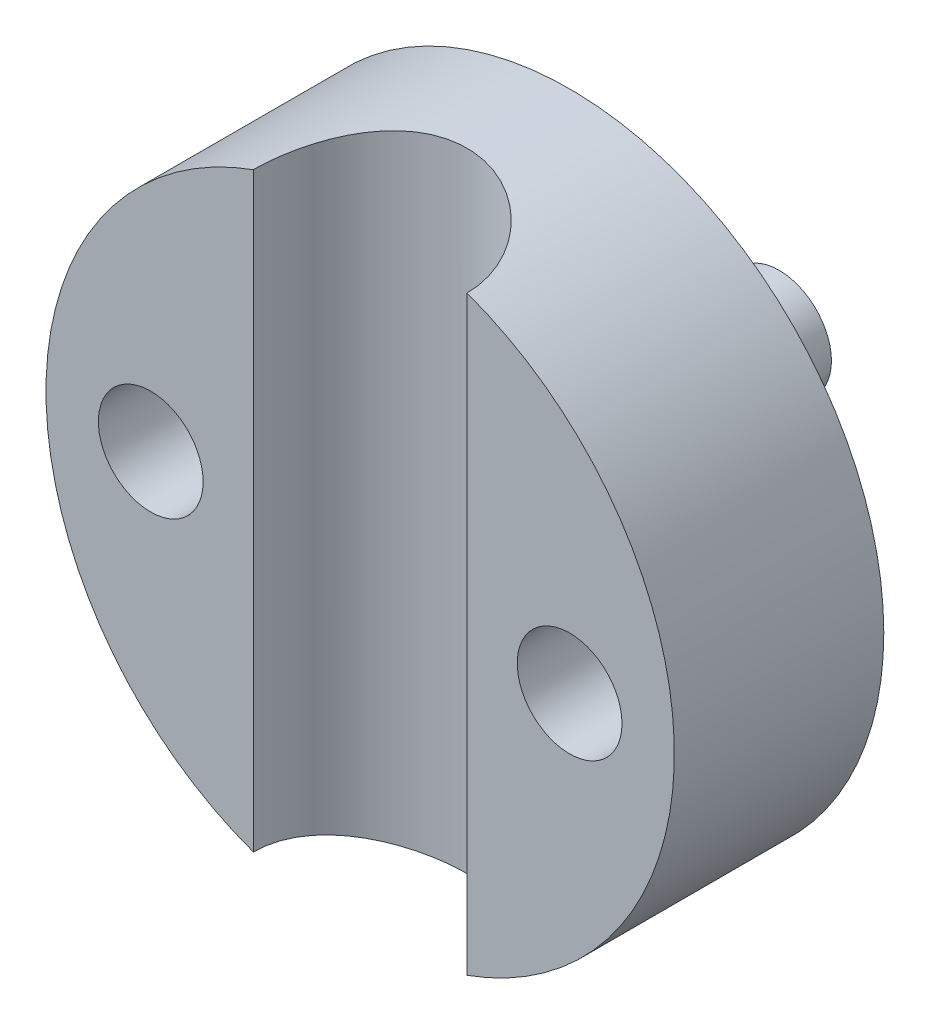
ISO-10303-21;
HEADER;
FILE_DESCRIPTION(('STEP AP214'),'2;1');
FILE_NAME('part.step','',(''),(''),'','','');
FILE_SCHEMA(('AUTOMOTIVE_DESIGN { 1 0 10303 214 1 1 1 1 }'));
ENDSEC;
DATA;
#1=APPLICATION_CONTEXT('core data for automotive mechanical design processes');
#2=APPLICATION_PROTOCOL_DEFINITION('international standard','automotive_design',2000,#1);
#3=PRODUCT_CONTEXT('',#1,'mechanical');
#4=PRODUCT('Part','Part','',(#3));
#5=PRODUCT_RELATED_PRODUCT_CATEGORY('part','',(#4));
#6=PRODUCT_DEFINITION_FORMATION('','',#4);
#7=PRODUCT_DEFINITION_CONTEXT('part definition',#1,'design');
#8=PRODUCT_DEFINITION('design','',#6,#7);
#9=PRODUCT_DEFINITION_SHAPE('','',#8);
#10=(LENGTH_UNIT() NAMED_UNIT(*) SI_UNIT(.MILLI.,.METRE.));
#11=(NAMED_UNIT(*) PLANE_ANGLE_UNIT() SI_UNIT($,.RADIAN.));
#12=(NAMED_UNIT(*) SI_UNIT($,.STERADIAN.) SOLID_ANGLE_UNIT());
#13=UNCERTAINTY_MEASURE_WITH_UNIT(LENGTH_MEASURE(1.E-05),#10,'distance_accuracy_value','');
#14=(GEOMETRIC_REPRESENTATION_CONTEXT(3) GLOBAL_UNCERTAINTY_ASSIGNED_CONTEXT((#13)) GLOBAL_UNIT_ASSIGNED_CONTEXT((#10,
#11,#12)) REPRESENTATION_CONTEXT('',''));
#15=CARTESIAN_POINT('',(0.,0.,0.));
#16=DIRECTION('',(0.,0.,1.));
#17=DIRECTION('',(1.,0.,0.));
#18=AXIS2_PLACEMENT_3D('',#15,#16,#17);
#19=CARTESIAN_POINT('',(0.,0.,12.7));
#20=DIRECTION('',(0.,0.,-1.));
#21=DIRECTION('',(-1.,0.,0.));
#22=AXIS2_PLACEMENT_3D('',#19,#20,#21);
#23=CYLINDRICAL_SURFACE('',#22,19.05);
#24=CARTESIAN_POINT('',(0.,0.,0.));
#25=DIRECTION('',(0.,0.,1.));
#26=DIRECTION('',(1.,0.,0.));
#27=AXIS2_PLACEMENT_3D('',#24,#25,#26);
#28=CIRCLE('',#27,19.05);
#29=CARTESIAN_POINT('',(19.05,0.,0.));
#30=VERTEX_POINT('',#29);
#31=EDGE_CURVE('E73',#30,#30,#28,.T.);
#32=ORIENTED_EDGE('',*,*,#31,.T.);
#33=EDGE_LOOP('',(#32));
#34=FACE_BOUND('',#33,.T.);
#35=CARTESIAN_POINT('',(6.47699999999999,17.9151045489553,12.7));
#36=CARTESIAN_POINT('',(6.47702534828076,17.9150748305242,12.5235165475312));
#37=CARTESIAN_POINT('',(6.46978801662175,17.917711386757,12.3470443935045));
#38=CARTESIAN_POINT('',(6.44097680104019,17.9280994105072,11.9954737507611));
#39=CARTESIAN_POINT('',(6.4194069276115,17.9358494471797,11.8203748916365));
#40=CARTESIAN_POINT('',(6.36220645105465,17.9562159683009,11.4733308340743));
#41=CARTESIAN_POINT('',(6.32661885693651,17.9688175646031,11.3013776571298));
#42=CARTESIAN_POINT('',(6.24172333638176,17.998483898519,10.9612842177305));
#43=CARTESIAN_POINT('',(6.19241488444516,18.0155488070731,10.7931441015801));
#44=CARTESIAN_POINT('',(6.08055828703803,18.0536087870223,10.4619499226804));
#45=CARTESIAN_POINT('',(6.01802125193456,18.0746005586395,10.2988917227901));
#46=CARTESIAN_POINT('',(5.88016700117092,18.1199172071232,9.97868382205535));
#47=CARTESIAN_POINT('',(5.8048450299127,18.1442433236119,9.82153634648455));
#48=CARTESIAN_POINT('',(5.64198231004348,18.1955440154444,9.51412033778887));
#49=CARTESIAN_POINT('',(5.55443901965061,18.2225191413805,9.36385324429703));
#50=CARTESIAN_POINT('',(5.36771255883912,18.2783932430714,9.07103936947184));
#51=CARTESIAN_POINT('',(5.26852519960709,18.3072929095286,8.92849539355411));
#52=CARTESIAN_POINT('',(5.05533434841082,18.3673296453135,8.64692282291209));
#53=CARTESIAN_POINT('',(4.94092198856477,18.398509881975,8.50821285094172));
#54=CARTESIAN_POINT('',(4.70101687049525,18.4612651450173,8.24082587078322));
#55=CARTESIAN_POINT('',(4.57552388727333,18.4928401794036,8.1121490664243));
#56=CARTESIAN_POINT('',(4.3141518472243,18.5555560792226,7.86554859587034));
#57=CARTESIAN_POINT('',(4.17826737068099,18.5866967079402,7.7476306122559));
#58=CARTESIAN_POINT('',(3.89703263138712,18.6476896826207,7.52341851017628));
#59=CARTESIAN_POINT('',(3.75168567540193,18.6775424726334,7.41712036545513));
#60=CARTESIAN_POINT('',(3.4481406957571,18.7359914181175,7.21400589180445));
#61=CARTESIAN_POINT('',(3.28969617099699,18.7645285937695,7.11754044329463));
#62=CARTESIAN_POINT('',(2.96478253789072,18.8185992175984,6.93840331195255));
#63=CARTESIAN_POINT('',(2.79831657406827,18.8441338295356,6.85572627965216));
#64=CARTESIAN_POINT('',(2.45858331696745,18.8914594953902,6.70488524047806));
#65=CARTESIAN_POINT('',(2.28532201641907,18.9132537605655,6.63670877205241));
#66=CARTESIAN_POINT('',(1.93319141734603,18.952484637066,6.515423642005));
#67=CARTESIAN_POINT('',(1.75432354497232,18.9699223466111,6.46231118252394));
#68=CARTESIAN_POINT('',(1.31692241517264,19.0061632023526,6.35279515436016));
#69=CARTESIAN_POINT('',(1.05618306718973,19.0225203675833,6.30420240734888));
#70=CARTESIAN_POINT('',(0.530262450130259,19.0444363091269,6.23930870093945));
#71=CARTESIAN_POINT('',(0.265081448627456,19.0499957335735,6.22300580334402));
#72=CARTESIAN_POINT('',(-0.176438341944293,19.0500028397356,6.22299613729138));
#73=CARTESIAN_POINT('',(-0.352832579574388,19.0475446110804,6.23021227865421));
#74=CARTESIAN_POINT('',(-0.70436408731692,19.0377850474138,6.25899955015108));
#75=CARTESIAN_POINT('',(-0.879501127770772,19.0304828491984,6.28057323882758));
#76=CARTESIAN_POINT('',(-1.22726887197268,19.0112247916056,6.33789179125276));
#77=CARTESIAN_POINT('',(-1.39989818234291,18.9992664405409,6.37364424279492));
#78=CARTESIAN_POINT('',(-1.74139927202808,18.9710147055168,6.45900256293717));
#79=CARTESIAN_POINT('',(-1.91026959863235,18.9547196760593,6.50861369039292));
#80=CARTESIAN_POINT('',(-2.2426343905884,18.9182705501781,6.62111717296384));
#81=CARTESIAN_POINT('',(-2.40614105195636,18.8981260398923,6.68397657587062));
#82=CARTESIAN_POINT('',(-2.72718301405027,18.8544763085006,6.82253360568837));
#83=CARTESIAN_POINT('',(-2.88471604222607,18.8309698243083,6.8982360597052));
#84=CARTESIAN_POINT('',(-3.34673351482945,18.7563023098566,7.14371184773488));
#85=CARTESIAN_POINT('',(-3.6409565324091,18.700956367906,7.33196272404236));
#86=CARTESIAN_POINT('',(-4.20365176930587,18.5827159003846,7.75938242614079));
#87=CARTESIAN_POINT('',(-4.4709827090804,18.5196350696581,8.00000172440857));
#88=CARTESIAN_POINT('',(-4.83937650380282,18.4255011378798,8.39138177098701));
#89=CARTESIAN_POINT('',(-4.95680715961612,18.394183940284,8.52701623009659));
#90=CARTESIAN_POINT('',(-5.18010313620381,18.3325508679206,8.8076774717914));
#91=CARTESIAN_POINT('',(-5.28597269314974,18.3022346292454,8.95270078291528));
#92=CARTESIAN_POINT('',(-5.48854256599676,18.2425301405739,9.25591768502503));
#93=CARTESIAN_POINT('',(-5.5848576438351,18.2131996584886,9.41437998793801));
#94=CARTESIAN_POINT('',(-5.76369771735687,18.1573968614764,9.73930852288627));
#95=CARTESIAN_POINT('',(-5.84622801363533,18.1309234493264,9.90577164654989));
#96=CARTESIAN_POINT('',(-5.99680188036671,18.0816799218411,10.24553718676));
#97=CARTESIAN_POINT('',(-6.06485496848905,18.0589073758057,10.4188350206026));
#98=CARTESIAN_POINT('',(-6.18589929681761,18.0178028392713,10.7710419508032));
#99=CARTESIAN_POINT('',(-6.23889442469167,17.9994697027854,10.9499495855524));
#100=CARTESIAN_POINT('',(-6.34791450640724,17.9613797736106,11.3866913122976));
#101=CARTESIAN_POINT('',(-6.39623422029684,17.9441342077959,11.6467454289004));
#102=CARTESIAN_POINT('',(-6.44464151796232,17.9267773137026,12.0399738643063));
#103=CARTESIAN_POINT('',(-6.45676525910539,17.9224102282099,12.1716119258315));
#104=CARTESIAN_POINT('',(-6.47294549190853,17.9165710615568,12.4354846197782));
#105=CARTESIAN_POINT('',(-6.47699966590725,17.9150998121112,12.5677194126607));
#106=CARTESIAN_POINT('',(-6.47700000000001,17.9151045489553,12.7));
#107=B_SPLINE_CURVE_WITH_KNOTS('',3,(#35,#36,#37,#38,#39,#40,#41,#42,#43,#44,#45,#46,#47,#48,
#49,#50,#51,#52,#53,#54,#55,#56,#57,#58,#59,#60,#61,#62,#63,#64,#65,#66,#67,#68,#69,#70,#71,#72,
#73,#74,#75,#76,#77,#78,#79,#80,#81,#82,#83,#84,#85,#86,#87,#88,#89,#90,#91,#92,#93,#94,#95,#96,
#97,#98,#99,#100,#101,#102,#103,#104,#105,#106),.UNSPECIFIED.,.F.,.F.,(4,2,2,2,2,2,2,2,2,2,2,2,
2,2,2,2,2,2,2,2,2,2,2,2,2,2,2,2,2,2,2,2,2,2,2,4),(0.,0.529264812402781,1.05838158965913,
1.58588742660601,2.11341346946735,2.64049820271246,3.16777942644548,3.69517047760893,
4.22275183610053,4.76960533890781,5.31646994844628,5.86362174811743,6.4105833555485,
6.97293253348236,7.53506302765954,8.0967084663448,8.65821217979031,9.45314340246388,
10.2480269079677,10.7771017582681,11.3062709159759,11.8357236425867,12.3653775505048,
12.893729286687,13.4222800474665,14.4783731073121,15.5686385637497,16.1144898751053,
16.6601405019048,17.2226803114354,17.7850033097835,18.346955472952,18.9087624190701,
19.7014513447292,20.0980183834608,20.4946993038335),.UNSPECIFIED.);
#108=CARTESIAN_POINT('',(6.47699999999999,17.9151045489553,12.7));
#109=VERTEX_POINT('',#108);
#110=CARTESIAN_POINT('',(-6.477,17.9151045489553,12.7));
#111=VERTEX_POINT('',#110);
#112=EDGE_CURVE('E55',#109,#111,#107,.T.);
#113=ORIENTED_EDGE('',*,*,#112,.F.);
#114=CARTESIAN_POINT('',(0.,0.,12.7));
#115=DIRECTION('',(0.,0.,1.));
#116=DIRECTION('',(1.,0.,0.));
#117=AXIS2_PLACEMENT_3D('',#114,#115,#116);
#118=CIRCLE('',#117,19.05);
#119=CARTESIAN_POINT('',(6.47699999999999,-17.9151045489553,12.7));
#120=VERTEX_POINT('',#119);
#121=EDGE_CURVE('E63',#120,#109,#118,.T.);
#122=ORIENTED_EDGE('',*,*,#121,.F.);
#123=CARTESIAN_POINT('',(-6.47700000000001,-17.9151045489553,12.7));
#124=CARTESIAN_POINT('',(-6.47702534828078,-17.9150748305242,12.5235165475312));
#125=CARTESIAN_POINT('',(-6.46978801662177,-17.917711386757,12.3470443935045));
#126=CARTESIAN_POINT('',(-6.44097680104021,-17.9280994105072,11.9954737507611));
#127=CARTESIAN_POINT('',(-6.41940692761152,-17.9358494471797,11.8203748916365));
#128=CARTESIAN_POINT('',(-6.36220645105467,-17.9562159683009,11.4733308340743));
#129=CARTESIAN_POINT('',(-6.32661885693652,-17.9688175646031,11.3013776571298));
#130=CARTESIAN_POINT('',(-6.24172333638178,-17.998483898519,10.9612842177305));
#131=CARTESIAN_POINT('',(-6.19241488444517,-18.0155488070731,10.7931441015801));
#132=CARTESIAN_POINT('',(-6.08055828703805,-18.0536087870223,10.4619499226805));
#133=CARTESIAN_POINT('',(-6.01802125193458,-18.0746005586395,10.2988917227901));
#134=CARTESIAN_POINT('',(-5.88016700117094,-18.1199172071232,9.97868382205535));
#135=CARTESIAN_POINT('',(-5.80484502991272,-18.1442433236119,9.82153634648455));
#136=CARTESIAN_POINT('',(-5.6419823100435,-18.1955440154444,9.51412033778887));
#137=CARTESIAN_POINT('',(-5.55443901965062,-18.2225191413805,9.36385324429703));
#138=CARTESIAN_POINT('',(-5.36771255883914,-18.2783932430714,9.07103936947184));
#139=CARTESIAN_POINT('',(-5.2685251996071,-18.3072929095286,8.92849539355411));
#140=CARTESIAN_POINT('',(-5.05533434841084,-18.3673296453135,8.64692282291209));
#141=CARTESIAN_POINT('',(-4.94092198856479,-18.398509881975,8.50821285094172));
#142=CARTESIAN_POINT('',(-4.70101687049527,-18.4612651450173,8.24082587078322));
#143=CARTESIAN_POINT('',(-4.57552388727334,-18.4928401794036,8.1121490664243));
#144=CARTESIAN_POINT('',(-4.31415184722432,-18.5555560792226,7.86554859587034));
#145=CARTESIAN_POINT('',(-4.178267370681,-18.5866967079402,7.7476306122559));
#146=CARTESIAN_POINT('',(-3.89703263138713,-18.6476896826207,7.52341851017628));
#147=CARTESIAN_POINT('',(-3.75168567540195,-18.6775424726334,7.41712036545513));
#148=CARTESIAN_POINT('',(-3.44814069575711,-18.7359914181175,7.21400589180445));
#149=CARTESIAN_POINT('',(-3.28969617099701,-18.7645285937695,7.11754044329463));
#150=CARTESIAN_POINT('',(-2.96478253789074,-18.8185992175984,6.93840331195256));
#151=CARTESIAN_POINT('',(-2.79831657406829,-18.8441338295356,6.85572627965216));
#152=CARTESIAN_POINT('',(-2.45858331696747,-18.8914594953902,6.70488524047806));
#153=CARTESIAN_POINT('',(-2.28532201641909,-18.9132537605654,6.63670877205242));
#154=CARTESIAN_POINT('',(-1.93319141734605,-18.952484637066,6.515423642005));
#155=CARTESIAN_POINT('',(-1.75432354497234,-18.9699223466111,6.46231118252394));
#156=CARTESIAN_POINT('',(-1.31692241517266,-19.0061632023526,6.35279515436016));
#157=CARTESIAN_POINT('',(-1.05618306718975,-19.0225203675833,6.30420240734888));
#158=CARTESIAN_POINT('',(-0.53026245013027,-19.0444363091269,6.23930870093945));
#159=CARTESIAN_POINT('',(-0.265081448627465,-19.0499957335735,6.22300580334402));
#160=CARTESIAN_POINT('',(0.176438341944286,-19.0500028397356,6.22299613729138));
#161=CARTESIAN_POINT('',(0.352832579574381,-19.0475446110804,6.23021227865421));
#162=CARTESIAN_POINT('',(0.704364087316914,-19.0377850474138,6.25899955015108));
#163=CARTESIAN_POINT('',(0.879501127770766,-19.0304828491984,6.28057323882758));
#164=CARTESIAN_POINT('',(1.22726887197267,-19.0112247916056,6.33789179125276));
#165=CARTESIAN_POINT('',(1.3998981823429,-18.9992664405409,6.37364424279492));
#166=CARTESIAN_POINT('',(1.74139927202807,-18.9710147055168,6.45900256293717));
#167=CARTESIAN_POINT('',(1.91026959863234,-18.9547196760593,6.50861369039292));
#168=CARTESIAN_POINT('',(2.24263439058839,-18.9182705501781,6.62111717296384));
#169=CARTESIAN_POINT('',(2.40614105195635,-18.8981260398923,6.68397657587062));
#170=CARTESIAN_POINT('',(2.72718301405026,-18.8544763085006,6.82253360568837));
#171=CARTESIAN_POINT('',(2.88471604222606,-18.8309698243083,6.89823605970521));
#172=CARTESIAN_POINT('',(3.34673351482945,-18.7563023098566,7.14371184773488));
#173=CARTESIAN_POINT('',(3.64095653240909,-18.700956367906,7.33196272404237));
#174=CARTESIAN_POINT('',(4.20365176930587,-18.5827159003846,7.7593824261408));
#175=CARTESIAN_POINT('',(4.47098270908039,-18.5196350696581,8.00000172440858));
#176=CARTESIAN_POINT('',(4.83937650380281,-18.4255011378798,8.39138177098702));
#177=CARTESIAN_POINT('',(4.95680715961611,-18.394183940284,8.5270162300966));
#178=CARTESIAN_POINT('',(5.1801031362038,-18.3325508679206,8.8076774717914));
#179=CARTESIAN_POINT('',(5.28597269314973,-18.3022346292454,8.95270078291529));
#180=CARTESIAN_POINT('',(5.48854256599675,-18.2425301405739,9.25591768502504));
#181=CARTESIAN_POINT('',(5.58485764383509,-18.2131996584886,9.41437998793802));
#182=CARTESIAN_POINT('',(5.76369771735687,-18.1573968614764,9.73930852288628));
#183=CARTESIAN_POINT('',(5.84622801363532,-18.1309234493264,9.9057716465499));
#184=CARTESIAN_POINT('',(5.9968018803667,-18.0816799218411,10.24553718676));
#185=CARTESIAN_POINT('',(6.06485496848904,-18.0589073758057,10.4188350206026));
#186=CARTESIAN_POINT('',(6.1858992968176,-18.0178028392713,10.7710419508033));
#187=CARTESIAN_POINT('',(6.23889442469166,-17.9994697027854,10.9499495855524));
#188=CARTESIAN_POINT('',(6.34791450640722,-17.9613797736106,11.3866913122977));
#189=CARTESIAN_POINT('',(6.39623422029682,-17.9441342077959,11.6467454289004));
#190=CARTESIAN_POINT('',(6.4446415179623,-17.9267773137026,12.0399738643063));
#191=CARTESIAN_POINT('',(6.45676525910537,-17.9224102282099,12.1716119258315));
#192=CARTESIAN_POINT('',(6.47294549190851,-17.9165710615568,12.4354846197783));
#193=CARTESIAN_POINT('',(6.47699966590724,-17.9150998121112,12.5677194126607));
#194=CARTESIAN_POINT('',(6.47699999999999,-17.9151045489553,12.7));
#195=B_SPLINE_CURVE_WITH_KNOTS('',3,(#123,#124,#125,#126,#127,#128,#129,#130,#131,#132,#133,
#134,#135,#136,#137,#138,#139,#140,#141,#142,#143,#144,#145,#146,#147,#148,#149,#150,#151,#152,
#153,#154,#155,#156,#157,#158,#159,#160,#161,#162,#163,#164,#165,#166,#167,#168,#169,#170,#171,
#172,#173,#174,#175,#176,#177,#178,#179,#180,#181,#182,#183,#184,#185,#186,#187,#188,#189,#190,
#191,#192,#193,#194),.UNSPECIFIED.,.F.,.F.,(4,2,2,2,2,2,2,2,2,2,2,2,2,2,2,2,2,2,2,2,2,2,2,2,2,2,
2,2,2,2,2,2,2,2,2,4),(0.,0.529264812402783,1.05838158965913,1.58588742660601,2.11341346946734,
2.64049820271246,3.16777942644547,3.69517047760893,4.22275183610052,4.76960533890781,
5.31646994844627,5.86362174811742,6.41058335554849,6.97293253348235,7.53506302765953,
8.09670846634479,8.6582121797903,9.45314340246388,10.2480269079677,10.7771017582681,
11.3062709159759,11.8357236425867,12.3653775505048,12.893729286687,13.4222800474665,
14.4783731073121,15.5686385637497,16.1144898751053,16.6601405019048,17.2226803114354,
17.7850033097835,18.346955472952,18.9087624190701,19.7014513447292,20.0980183834608,
20.4946993038335),.UNSPECIFIED.);
#196=CARTESIAN_POINT('',(-6.47700000000001,-17.9151045489553,12.7));
#197=VERTEX_POINT('',#196);
#198=EDGE_CURVE('E50',#197,#120,#195,.T.);
#199=ORIENTED_EDGE('',*,*,#198,.F.);
#200=EDGE_CURVE('E65',#111,#197,#118,.T.);
#201=ORIENTED_EDGE('',*,*,#200,.F.);
#202=EDGE_LOOP('',(#113,#122,#199,#201));
#203=FACE_BOUND('',#202,.T.);
#204=ADVANCED_FACE('F33',(#34,#203),#23,.T.);
#205=CARTESIAN_POINT('',(0.,0.,12.7));
#206=DIRECTION('',(0.,0.,1.));
#207=DIRECTION('',(1.,0.,0.));
#208=AXIS2_PLACEMENT_3D('',#205,#206,#207);
#209=PLANE('',#208);
#210=CARTESIAN_POINT('',(-12.7,0.,12.7));
#211=DIRECTION('',(0.,0.,1.));
#212=DIRECTION('',(1.,0.,0.));
#213=AXIS2_PLACEMENT_3D('',#210,#211,#212);
#214=CIRCLE('',#213,3.175);
#215=CARTESIAN_POINT('',(-9.525,0.,12.7));
#216=VERTEX_POINT('',#215);
#217=EDGE_CURVE('E91',#216,#216,#214,.T.);
#218=ORIENTED_EDGE('',*,*,#217,.F.);
#219=EDGE_LOOP('',(#218));
#220=FACE_BOUND('',#219,.T.);
#221=ORIENTED_EDGE('',*,*,#200,.T.);
#222=DIRECTION('',(0.,-1.,0.));
#223=VECTOR('',#222,1.);
#224=CARTESIAN_POINT('',(-6.47700000000001,19.05,12.7));
#225=LINE('',#224,#223);
#226=EDGE_CURVE('E11',#197,#111,#225,.F.);
#227=ORIENTED_EDGE('',*,*,#226,.T.);
#228=EDGE_LOOP('',(#221,#227));
#229=FACE_BOUND('',#228,.T.);
#230=ADVANCED_FACE('F116',(#220,#229),#209,.T.);
#231=CARTESIAN_POINT('',(12.7,0.,12.7));
#232=DIRECTION('',(0.,0.,1.));
#233=DIRECTION('',(1.,0.,0.));
#234=AXIS2_PLACEMENT_3D('',#231,#232,#233);
#235=CIRCLE('',#234,3.175);
#236=CARTESIAN_POINT('',(15.875,0.,12.7));
#237=VERTEX_POINT('',#236);
#238=EDGE_CURVE('E82',#237,#237,#235,.T.);
#239=ORIENTED_EDGE('',*,*,#238,.F.);
#240=EDGE_LOOP('',(#239));
#241=FACE_BOUND('',#240,.T.);
#242=ORIENTED_EDGE('',*,*,#121,.T.);
#243=DIRECTION('',(0.,-1.,0.));
#244=VECTOR('',#243,1.);
#245=CARTESIAN_POINT('',(6.47699999999999,19.05,12.7));
#246=LINE('',#245,#244);
#247=EDGE_CURVE('E42',#109,#120,#246,.T.);
#248=ORIENTED_EDGE('',*,*,#247,.T.);
#249=EDGE_LOOP('',(#242,#248));
#250=FACE_BOUND('',#249,.T.);
#251=ADVANCED_FACE('F72',(#241,#250),#209,.T.);
#252=CARTESIAN_POINT('',(0.,0.,0.));
#253=DIRECTION('',(0.,0.,1.));
#254=DIRECTION('',(1.,0.,0.));
#255=AXIS2_PLACEMENT_3D('',#252,#253,#254);
#256=PLANE('',#255);
#257=CARTESIAN_POINT('',(-12.7,0.,0.));
#258=DIRECTION('',(0.,0.,1.));
#259=DIRECTION('',(1.,0.,0.));
#260=AXIS2_PLACEMENT_3D('',#257,#258,#259);
#261=CIRCLE('',#260,3.175);
#262=CARTESIAN_POINT('',(-9.525,0.,0.));
#263=VERTEX_POINT('',#262);
#264=EDGE_CURVE('E37',#263,#263,#261,.T.);
#265=ORIENTED_EDGE('',*,*,#264,.T.);
#266=EDGE_LOOP('',(#265));
#267=FACE_BOUND('',#266,.T.);
#268=CARTESIAN_POINT('',(12.7,0.,0.));
#269=DIRECTION('',(0.,0.,1.));
#270=DIRECTION('',(1.,0.,0.));
#271=AXIS2_PLACEMENT_3D('',#268,#269,#270);
#272=CIRCLE('',#271,3.175);
#273=CARTESIAN_POINT('',(15.875,0.,0.));
#274=VERTEX_POINT('',#273);
#275=EDGE_CURVE('E80',#274,#274,#272,.T.);
#276=ORIENTED_EDGE('',*,*,#275,.T.);
#277=EDGE_LOOP('',(#276));
#278=FACE_BOUND('',#277,.T.);
#279=ORIENTED_EDGE('',*,*,#31,.F.);
#280=EDGE_LOOP('',(#279));
#281=FACE_BOUND('',#280,.T.);
#282=CARTESIAN_POINT('',(0.,0.,0.));
#283=DIRECTION('',(0.,0.,1.));
#284=DIRECTION('',(1.,0.,0.));
#285=AXIS2_PLACEMENT_3D('',#282,#283,#284);
#286=CIRCLE('',#285,3.175);
#287=CARTESIAN_POINT('',(3.175,0.,0.));
#288=VERTEX_POINT('',#287);
#289=EDGE_CURVE('E70',#288,#288,#286,.F.);
#290=ORIENTED_EDGE('',*,*,#289,.F.);
#291=EDGE_LOOP('',(#290));
#292=FACE_BOUND('',#291,.T.);
#293=ADVANCED_FACE('F114',(#267,#278,#281,#292),#256,.F.);
#294=CARTESIAN_POINT('',(0.,0.,-12.7));
#295=DIRECTION('',(0.,0.,1.));
#296=DIRECTION('',(1.,0.,0.));
#297=AXIS2_PLACEMENT_3D('',#294,#295,#296);
#298=CYLINDRICAL_SURFACE('',#297,3.175);
#299=CARTESIAN_POINT('',(0.,0.,-12.7));
#300=DIRECTION('',(0.,0.,-1.));
#301=DIRECTION('',(-1.,0.,0.));
#302=AXIS2_PLACEMENT_3D('',#299,#300,#301);
#303=CIRCLE('',#302,3.175);
#304=CARTESIAN_POINT('',(-3.175,0.,-12.7));
#305=VERTEX_POINT('',#304);
#306=EDGE_CURVE('E66',#305,#305,#303,.T.);
#307=ORIENTED_EDGE('',*,*,#306,.F.);
#308=EDGE_LOOP('',(#307));
#309=FACE_BOUND('',#308,.T.);
#310=ORIENTED_EDGE('',*,*,#289,.T.);
#311=EDGE_LOOP('',(#310));
#312=FACE_BOUND('',#311,.T.);
#313=ADVANCED_FACE('F110',(#309,#312),#298,.T.);
#314=CARTESIAN_POINT('',(0.,0.,-12.7));
#315=DIRECTION('',(0.,0.,-1.));
#316=DIRECTION('',(-1.,0.,0.));
#317=AXIS2_PLACEMENT_3D('',#314,#315,#316);
#318=PLANE('',#317);
#319=ORIENTED_EDGE('',*,*,#306,.T.);
#320=EDGE_LOOP('',(#319));
#321=FACE_BOUND('',#320,.T.);
#322=ADVANCED_FACE('F105',(#321),#318,.T.);
#323=CARTESIAN_POINT('',(0.,19.05,12.7));
#324=DIRECTION('',(0.,-1.,0.));
#325=DIRECTION('',(0.,0.,-1.));
#326=AXIS2_PLACEMENT_3D('',#323,#324,#325);
#327=CYLINDRICAL_SURFACE('',#326,6.477);
#328=ORIENTED_EDGE('',*,*,#112,.T.);
#329=ORIENTED_EDGE('',*,*,#226,.F.);
#330=ORIENTED_EDGE('',*,*,#198,.T.);
#331=ORIENTED_EDGE('',*,*,#247,.F.);
#332=EDGE_LOOP('',(#328,#329,#330,#331));
#333=FACE_BOUND('',#332,.T.);
#334=ADVANCED_FACE('F68',(#333),#327,.F.);
#335=CARTESIAN_POINT('',(12.7,0.,-60.96));
#336=DIRECTION('',(0.,0.,1.));
#337=DIRECTION('',(1.,0.,0.));
#338=AXIS2_PLACEMENT_3D('',#335,#336,#337);
#339=CYLINDRICAL_SURFACE('',#338,3.175);
#340=ORIENTED_EDGE('',*,*,#238,.T.);
#341=EDGE_LOOP('',(#340));
#342=FACE_BOUND('',#341,.T.);
#343=ORIENTED_EDGE('',*,*,#275,.F.);
#344=EDGE_LOOP('',(#343));
#345=FACE_BOUND('',#344,.T.);
#346=ADVANCED_FACE('F104',(#342,#345),#339,.F.);
#347=CARTESIAN_POINT('',(-12.7,0.,-60.96));
#348=DIRECTION('',(0.,0.,1.));
#349=DIRECTION('',(1.,0.,0.));
#350=AXIS2_PLACEMENT_3D('',#347,#348,#349);
#351=CYLINDRICAL_SURFACE('',#350,3.175);
#352=ORIENTED_EDGE('',*,*,#217,.T.);
#353=EDGE_LOOP('',(#352));
#354=FACE_BOUND('',#353,.T.);
#355=ORIENTED_EDGE('',*,*,#264,.F.);
#356=EDGE_LOOP('',(#355));
#357=FACE_BOUND('',#356,.T.);
#358=ADVANCED_FACE('F159',(#354,#357),#351,.F.);
#359=CLOSED_SHELL('',(#204,#230,#251,#293,#313,#322,#334,#346,#358));
#360=MANIFOLD_SOLID_BREP('B2',#359);
#361=ADVANCED_BREP_SHAPE_REPRESENTATION('',(#18,#360),#14);
#362=SHAPE_DEFINITION_REPRESENTATION(#9,#361);
ENDSEC;
END-ISO-10303-21;
